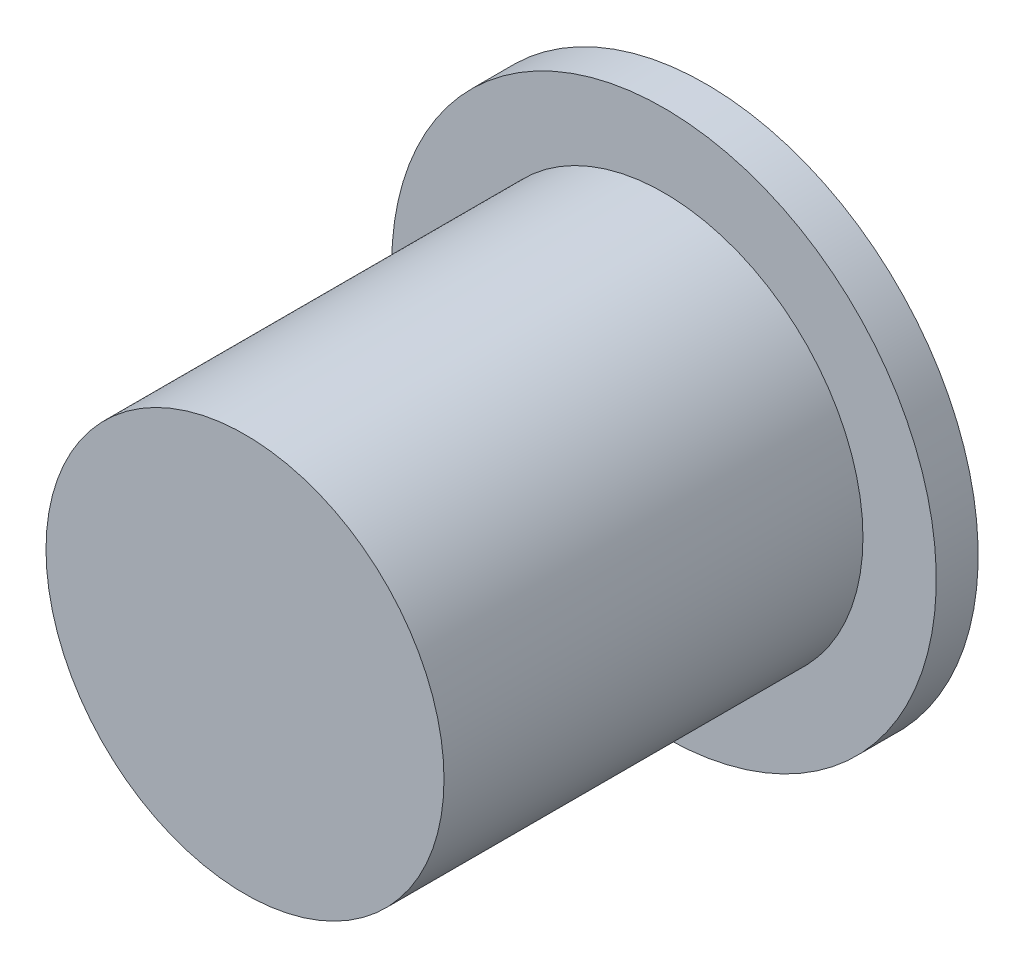
ISO-10303-21;
HEADER;
FILE_DESCRIPTION(('STEP AP214'),'2;1');
FILE_NAME('part.step','',(''),(''),'','','');
FILE_SCHEMA(('AUTOMOTIVE_DESIGN { 1 0 10303 214 1 1 1 1 }'));
ENDSEC;
DATA;
#1=APPLICATION_CONTEXT('core data for automotive mechanical design processes');
#2=APPLICATION_PROTOCOL_DEFINITION('international standard','automotive_design',2000,#1);
#3=PRODUCT_CONTEXT('',#1,'mechanical');
#4=PRODUCT('Part','Part','',(#3));
#5=PRODUCT_RELATED_PRODUCT_CATEGORY('part','',(#4));
#6=PRODUCT_DEFINITION_FORMATION('','',#4);
#7=PRODUCT_DEFINITION_CONTEXT('part definition',#1,'design');
#8=PRODUCT_DEFINITION('design','',#6,#7);
#9=PRODUCT_DEFINITION_SHAPE('','',#8);
#10=(LENGTH_UNIT() NAMED_UNIT(*) SI_UNIT(.MILLI.,.METRE.));
#11=(NAMED_UNIT(*) PLANE_ANGLE_UNIT() SI_UNIT($,.RADIAN.));
#12=(NAMED_UNIT(*) SI_UNIT($,.STERADIAN.) SOLID_ANGLE_UNIT());
#13=UNCERTAINTY_MEASURE_WITH_UNIT(LENGTH_MEASURE(1.E-05),#10,'distance_accuracy_value','');
#14=(GEOMETRIC_REPRESENTATION_CONTEXT(3) GLOBAL_UNCERTAINTY_ASSIGNED_CONTEXT((#13)) GLOBAL_UNIT_ASSIGNED_CONTEXT((#10,
#11,#12)) REPRESENTATION_CONTEXT('',''));
#15=CARTESIAN_POINT('',(0.,0.,0.));
#16=DIRECTION('',(0.,0.,1.));
#17=DIRECTION('',(1.,0.,0.));
#18=AXIS2_PLACEMENT_3D('',#15,#16,#17);
#19=CARTESIAN_POINT('',(0.,0.,5.));
#20=DIRECTION('',(0.,0.,-1.));
#21=DIRECTION('',(-1.,0.,0.));
#22=AXIS2_PLACEMENT_3D('',#19,#20,#21);
#23=CYLINDRICAL_SURFACE('',#22,2.375);
#24=CARTESIAN_POINT('',(0.,0.,5.));
#25=DIRECTION('',(0.,0.,1.));
#26=DIRECTION('',(1.,0.,0.));
#27=AXIS2_PLACEMENT_3D('',#24,#25,#26);
#28=CIRCLE('',#27,2.375);
#29=CARTESIAN_POINT('',(2.375,0.,5.));
#30=VERTEX_POINT('',#29);
#31=EDGE_CURVE('E10',#30,#30,#28,.T.);
#32=ORIENTED_EDGE('',*,*,#31,.F.);
#33=EDGE_LOOP('',(#32));
#34=FACE_BOUND('',#33,.T.);
#35=CARTESIAN_POINT('',(0.,0.,0.));
#36=DIRECTION('',(0.,0.,-1.));
#37=DIRECTION('',(-1.,0.,0.));
#38=AXIS2_PLACEMENT_3D('',#35,#36,#37);
#39=CIRCLE('',#38,2.375);
#40=CARTESIAN_POINT('',(-2.375,0.,0.));
#41=VERTEX_POINT('',#40);
#42=EDGE_CURVE('E37',#41,#41,#39,.T.);
#43=ORIENTED_EDGE('',*,*,#42,.F.);
#44=EDGE_LOOP('',(#43));
#45=FACE_BOUND('',#44,.T.);
#46=ADVANCED_FACE('F31',(#34,#45),#23,.T.);
#47=CARTESIAN_POINT('',(0.,0.,5.));
#48=DIRECTION('',(0.,0.,1.));
#49=DIRECTION('',(1.,0.,0.));
#50=AXIS2_PLACEMENT_3D('',#47,#48,#49);
#51=PLANE('',#50);
#52=ORIENTED_EDGE('',*,*,#31,.T.);
#53=EDGE_LOOP('',(#52));
#54=FACE_BOUND('',#53,.T.);
#55=ADVANCED_FACE('F79',(#54),#51,.T.);
#56=CARTESIAN_POINT('',(0.,0.,0.));
#57=DIRECTION('',(0.,0.,-1.));
#58=DIRECTION('',(-1.,0.,0.));
#59=AXIS2_PLACEMENT_3D('',#56,#57,#58);
#60=PLANE('',#59);
#61=CARTESIAN_POINT('',(0.,0.,0.));
#62=DIRECTION('',(0.,0.,-1.));
#63=DIRECTION('',(-1.,0.,0.));
#64=AXIS2_PLACEMENT_3D('',#61,#62,#63);
#65=CIRCLE('',#64,3.25);
#66=CARTESIAN_POINT('',(-3.25,0.,0.));
#67=VERTEX_POINT('',#66);
#68=EDGE_CURVE('E45',#67,#67,#65,.T.);
#69=ORIENTED_EDGE('',*,*,#68,.F.);
#70=EDGE_LOOP('',(#69));
#71=FACE_BOUND('',#70,.T.);
#72=ORIENTED_EDGE('',*,*,#42,.T.);
#73=EDGE_LOOP('',(#72));
#74=FACE_BOUND('',#73,.T.);
#75=ADVANCED_FACE('F74',(#71,#74),#60,.F.);
#76=CARTESIAN_POINT('',(0.,0.,-0.5));
#77=DIRECTION('',(0.,0.,1.));
#78=DIRECTION('',(1.,0.,0.));
#79=AXIS2_PLACEMENT_3D('',#76,#77,#78);
#80=CYLINDRICAL_SURFACE('',#79,3.25);
#81=CARTESIAN_POINT('',(0.,0.,-0.5));
#82=DIRECTION('',(0.,0.,-1.));
#83=DIRECTION('',(-1.,0.,0.));
#84=AXIS2_PLACEMENT_3D('',#81,#82,#83);
#85=CIRCLE('',#84,3.25);
#86=CARTESIAN_POINT('',(-3.25,0.,-0.5));
#87=VERTEX_POINT('',#86);
#88=EDGE_CURVE('E41',#87,#87,#85,.T.);
#89=ORIENTED_EDGE('',*,*,#88,.F.);
#90=EDGE_LOOP('',(#89));
#91=FACE_BOUND('',#90,.T.);
#92=ORIENTED_EDGE('',*,*,#68,.T.);
#93=EDGE_LOOP('',(#92));
#94=FACE_BOUND('',#93,.T.);
#95=ADVANCED_FACE('F68',(#91,#94),#80,.T.);
#96=CARTESIAN_POINT('',(0.,0.,-0.5));
#97=DIRECTION('',(0.,0.,-1.));
#98=DIRECTION('',(-1.,0.,0.));
#99=AXIS2_PLACEMENT_3D('',#96,#97,#98);
#100=PLANE('',#99);
#101=CARTESIAN_POINT('',(0.,0.,-0.5));
#102=DIRECTION('',(0.,0.,-1.));
#103=DIRECTION('',(-1.,0.,0.));
#104=AXIS2_PLACEMENT_3D('',#101,#102,#103);
#105=CIRCLE('',#104,1.75);
#106=CARTESIAN_POINT('',(-1.75,0.,-0.5));
#107=VERTEX_POINT('',#106);
#108=EDGE_CURVE('E51',#107,#107,#105,.T.);
#109=ORIENTED_EDGE('',*,*,#108,.F.);
#110=EDGE_LOOP('',(#109));
#111=FACE_BOUND('',#110,.T.);
#112=ORIENTED_EDGE('',*,*,#88,.T.);
#113=EDGE_LOOP('',(#112));
#114=FACE_BOUND('',#113,.T.);
#115=ADVANCED_FACE('F62',(#111,#114),#100,.T.);
#116=CARTESIAN_POINT('',(0.,0.,-0.25));
#117=DIRECTION('',(0.,0.,-1.));
#118=DIRECTION('',(-1.,0.,0.));
#119=AXIS2_PLACEMENT_3D('',#116,#117,#118);
#120=CYLINDRICAL_SURFACE('',#119,1.75);
#121=CARTESIAN_POINT('',(0.,0.,-0.25));
#122=DIRECTION('',(0.,0.,-1.));
#123=DIRECTION('',(-1.,0.,0.));
#124=AXIS2_PLACEMENT_3D('',#121,#122,#123);
#125=CIRCLE('',#124,1.75);
#126=CARTESIAN_POINT('',(-1.75,0.,-0.25));
#127=VERTEX_POINT('',#126);
#128=EDGE_CURVE('E49',#127,#127,#125,.T.);
#129=ORIENTED_EDGE('',*,*,#128,.F.);
#130=EDGE_LOOP('',(#129));
#131=FACE_BOUND('',#130,.T.);
#132=ORIENTED_EDGE('',*,*,#108,.T.);
#133=EDGE_LOOP('',(#132));
#134=FACE_BOUND('',#133,.T.);
#135=ADVANCED_FACE('F59',(#131,#134),#120,.F.);
#136=CARTESIAN_POINT('',(0.,0.,-0.25));
#137=DIRECTION('',(0.,0.,-1.));
#138=DIRECTION('',(-1.,0.,0.));
#139=AXIS2_PLACEMENT_3D('',#136,#137,#138);
#140=PLANE('',#139);
#141=ORIENTED_EDGE('',*,*,#128,.T.);
#142=EDGE_LOOP('',(#141));
#143=FACE_BOUND('',#142,.T.);
#144=ADVANCED_FACE('F57',(#143),#140,.T.);
#145=CLOSED_SHELL('',(#46,#55,#75,#95,#115,#135,#144));
#146=MANIFOLD_SOLID_BREP('B2',#145);
#147=ADVANCED_BREP_SHAPE_REPRESENTATION('',(#18,#146),#14);
#148=SHAPE_DEFINITION_REPRESENTATION(#9,#147);
ENDSEC;
END-ISO-10303-21;
